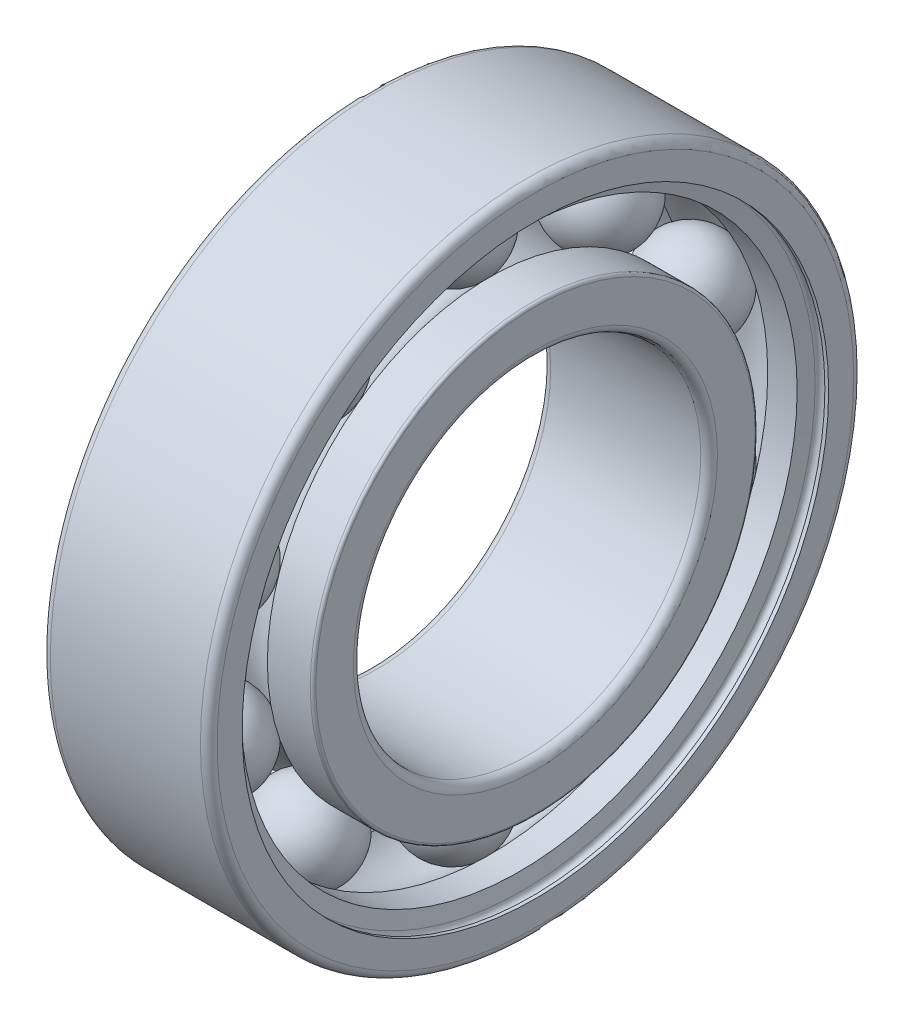
ISO-10303-21;
HEADER;
FILE_DESCRIPTION(('STEP AP214'),'2;1');
FILE_NAME('part.step','',(''),(''),'','','');
FILE_SCHEMA(('AUTOMOTIVE_DESIGN { 1 0 10303 214 1 1 1 1 }'));
ENDSEC;
DATA;
#1=APPLICATION_CONTEXT('core data for automotive mechanical design processes');
#2=APPLICATION_PROTOCOL_DEFINITION('international standard','automotive_design',2000,#1);
#3=PRODUCT_CONTEXT('',#1,'mechanical');
#4=PRODUCT('Part','Part','',(#3));
#5=PRODUCT_RELATED_PRODUCT_CATEGORY('part','',(#4));
#6=PRODUCT_DEFINITION_FORMATION('','',#4);
#7=PRODUCT_DEFINITION_CONTEXT('part definition',#1,'design');
#8=PRODUCT_DEFINITION('design','',#6,#7);
#9=PRODUCT_DEFINITION_SHAPE('','',#8);
#10=(LENGTH_UNIT() NAMED_UNIT(*) SI_UNIT(.MILLI.,.METRE.));
#11=(NAMED_UNIT(*) PLANE_ANGLE_UNIT() SI_UNIT($,.RADIAN.));
#12=(NAMED_UNIT(*) SI_UNIT($,.STERADIAN.) SOLID_ANGLE_UNIT());
#13=UNCERTAINTY_MEASURE_WITH_UNIT(LENGTH_MEASURE(1.E-05),#10,'distance_accuracy_value','');
#14=(GEOMETRIC_REPRESENTATION_CONTEXT(3) GLOBAL_UNCERTAINTY_ASSIGNED_CONTEXT((#13)) GLOBAL_UNIT_ASSIGNED_CONTEXT((#10,
#11,#12)) REPRESENTATION_CONTEXT('',''));
#15=CARTESIAN_POINT('',(0.,0.,0.));
#16=DIRECTION('',(0.,0.,1.));
#17=DIRECTION('',(1.,0.,0.));
#18=AXIS2_PLACEMENT_3D('',#15,#16,#17);
#19=CARTESIAN_POINT('',(0.599999999999874,0.,0.));
#20=DIRECTION('',(1.,0.,0.));
#21=DIRECTION('',(0.,0.,-1.));
#22=AXIS2_PLACEMENT_3D('',#19,#20,#21);
#23=TOROIDAL_SURFACE('',#22,13.0999999999999,0.599999999999874);
#24=CARTESIAN_POINT('',(0.6,0.,0.));
#25=DIRECTION('',(1.,0.,0.));
#26=DIRECTION('',(0.,0.,-1.));
#27=AXIS2_PLACEMENT_3D('',#24,#25,#26);
#28=CIRCLE('',#27,12.5);
#29=CARTESIAN_POINT('',(0.6,0.,-12.5));
#30=VERTEX_POINT('',#29);
#31=EDGE_CURVE('P0_E10',#30,#30,#28,.T.);
#32=ORIENTED_EDGE('',*,*,#31,.T.);
#33=EDGE_LOOP('',(#32));
#34=FACE_BOUND('',#33,.T.);
#35=CARTESIAN_POINT('',(0.,0.,0.));
#36=DIRECTION('',(1.,0.,0.));
#37=DIRECTION('',(0.,0.,-1.));
#38=AXIS2_PLACEMENT_3D('',#35,#36,#37);
#39=CIRCLE('',#38,13.1);
#40=CARTESIAN_POINT('',(0.,0.,-13.1));
#41=VERTEX_POINT('',#40);
#42=EDGE_CURVE('P0_E48',#41,#41,#39,.T.);
#43=ORIENTED_EDGE('',*,*,#42,.F.);
#44=EDGE_LOOP('',(#43));
#45=FACE_BOUND('',#44,.T.);
#46=ADVANCED_FACE('P0_F14',(#34,#45),#23,.T.);
#47=CARTESIAN_POINT('',(11.4,0.,0.));
#48=DIRECTION('',(1.,0.,0.));
#49=DIRECTION('',(0.,0.,-1.));
#50=AXIS2_PLACEMENT_3D('',#47,#48,#49);
#51=CYLINDRICAL_SURFACE('',#50,12.5);
#52=CARTESIAN_POINT('',(11.4,0.,0.));
#53=DIRECTION('',(1.,0.,0.));
#54=DIRECTION('',(0.,0.,-1.));
#55=AXIS2_PLACEMENT_3D('',#52,#53,#54);
#56=CIRCLE('',#55,12.5);
#57=CARTESIAN_POINT('',(11.4,0.,-12.5));
#58=VERTEX_POINT('',#57);
#59=EDGE_CURVE('P0_E20',#58,#58,#56,.T.);
#60=ORIENTED_EDGE('',*,*,#59,.T.);
#61=EDGE_LOOP('',(#60));
#62=FACE_BOUND('',#61,.T.);
#63=ORIENTED_EDGE('',*,*,#31,.F.);
#64=EDGE_LOOP('',(#63));
#65=FACE_BOUND('',#64,.T.);
#66=ADVANCED_FACE('P0_F56',(#62,#65),#51,.F.);
#67=CARTESIAN_POINT('',(11.4000000000002,0.,0.));
#68=DIRECTION('',(1.,0.,0.));
#69=DIRECTION('',(0.,0.,-1.));
#70=AXIS2_PLACEMENT_3D('',#67,#68,#69);
#71=TOROIDAL_SURFACE('',#70,13.0999999999998,0.599999999999754);
#72=CARTESIAN_POINT('',(12.,0.,0.));
#73=DIRECTION('',(1.,0.,0.));
#74=DIRECTION('',(0.,0.,-1.));
#75=AXIS2_PLACEMENT_3D('',#72,#73,#74);
#76=CIRCLE('',#75,13.1);
#77=CARTESIAN_POINT('',(12.,0.,-13.1));
#78=VERTEX_POINT('',#77);
#79=EDGE_CURVE('P0_E24',#78,#78,#76,.T.);
#80=ORIENTED_EDGE('',*,*,#79,.T.);
#81=EDGE_LOOP('',(#80));
#82=FACE_BOUND('',#81,.T.);
#83=ORIENTED_EDGE('',*,*,#59,.F.);
#84=EDGE_LOOP('',(#83));
#85=FACE_BOUND('',#84,.T.);
#86=ADVANCED_FACE('P0_F61',(#82,#85),#71,.T.);
#87=CARTESIAN_POINT('',(12.,13.1,0.));
#88=DIRECTION('',(1.,0.,0.));
#89=DIRECTION('',(0.,0.,-1.));
#90=AXIS2_PLACEMENT_3D('',#87,#88,#89);
#91=PLANE('',#90);
#92=CARTESIAN_POINT('',(12.,0.,0.));
#93=DIRECTION('',(1.,0.,0.));
#94=DIRECTION('',(0.,0.,-1.));
#95=AXIS2_PLACEMENT_3D('',#92,#93,#94);
#96=CIRCLE('',#95,15.8);
#97=CARTESIAN_POINT('',(12.,0.,-15.8));
#98=VERTEX_POINT('',#97);
#99=EDGE_CURVE('P0_E28',#98,#98,#96,.T.);
#100=ORIENTED_EDGE('',*,*,#99,.T.);
#101=EDGE_LOOP('',(#100));
#102=FACE_BOUND('',#101,.T.);
#103=ORIENTED_EDGE('',*,*,#79,.F.);
#104=EDGE_LOOP('',(#103));
#105=FACE_BOUND('',#104,.T.);
#106=ADVANCED_FACE('P0_F65',(#102,#105),#91,.T.);
#107=CARTESIAN_POINT('',(11.7999999999989,0.,0.));
#108=DIRECTION('',(1.,0.,0.));
#109=DIRECTION('',(0.,0.,-1.));
#110=AXIS2_PLACEMENT_3D('',#107,#108,#109);
#111=TOROIDAL_SURFACE('',#110,15.7999999999989,0.200000000001057);
#112=CARTESIAN_POINT('',(11.8,0.,0.));
#113=DIRECTION('',(1.,0.,0.));
#114=DIRECTION('',(0.,0.,-1.));
#115=AXIS2_PLACEMENT_3D('',#112,#113,#114);
#116=CIRCLE('',#115,16.);
#117=CARTESIAN_POINT('',(11.8,0.,-16.));
#118=VERTEX_POINT('',#117);
#119=EDGE_CURVE('P0_E33',#118,#118,#116,.T.);
#120=ORIENTED_EDGE('',*,*,#119,.T.);
#121=EDGE_LOOP('',(#120));
#122=FACE_BOUND('',#121,.T.);
#123=ORIENTED_EDGE('',*,*,#99,.F.);
#124=EDGE_LOOP('',(#123));
#125=FACE_BOUND('',#124,.T.);
#126=ADVANCED_FACE('P0_F72',(#122,#125),#111,.T.);
#127=CARTESIAN_POINT('',(11.4,0.,0.));
#128=DIRECTION('',(1.,0.,0.));
#129=DIRECTION('',(0.,0.,-1.));
#130=AXIS2_PLACEMENT_3D('',#127,#128,#129);
#131=CYLINDRICAL_SURFACE('',#130,16.);
#132=CARTESIAN_POINT('',(8.7173288354559,0.,0.));
#133=DIRECTION('',(1.,0.,0.));
#134=DIRECTION('',(0.,0.,-1.));
#135=AXIS2_PLACEMENT_3D('',#132,#133,#134);
#136=CIRCLE('',#135,16.);
#137=CARTESIAN_POINT('',(8.7173288354559,0.,-16.));
#138=VERTEX_POINT('',#137);
#139=EDGE_CURVE('P0_E36',#138,#138,#136,.T.);
#140=ORIENTED_EDGE('',*,*,#139,.T.);
#141=EDGE_LOOP('',(#140));
#142=FACE_BOUND('',#141,.T.);
#143=ORIENTED_EDGE('',*,*,#119,.F.);
#144=EDGE_LOOP('',(#143));
#145=FACE_BOUND('',#144,.T.);
#146=ADVANCED_FACE('P0_F76',(#142,#145),#131,.T.);
#147=CARTESIAN_POINT('',(6.,0.,0.));
#148=DIRECTION('',(1.,0.,0.));
#149=DIRECTION('',(0.,0.,-1.));
#150=AXIS2_PLACEMENT_3D('',#147,#148,#149);
#151=TOROIDAL_SURFACE('',#150,18.,3.37400000000004);
#152=CARTESIAN_POINT('',(3.2826711645441,0.,0.));
#153=DIRECTION('',(1.,0.,0.));
#154=DIRECTION('',(0.,0.,-1.));
#155=AXIS2_PLACEMENT_3D('',#152,#153,#154);
#156=CIRCLE('',#155,16.);
#157=CARTESIAN_POINT('',(3.2826711645441,0.,-16.));
#158=VERTEX_POINT('',#157);
#159=EDGE_CURVE('P0_E39',#158,#158,#156,.T.);
#160=ORIENTED_EDGE('',*,*,#159,.T.);
#161=EDGE_LOOP('',(#160));
#162=FACE_BOUND('',#161,.T.);
#163=ORIENTED_EDGE('',*,*,#139,.F.);
#164=EDGE_LOOP('',(#163));
#165=FACE_BOUND('',#164,.T.);
#166=ADVANCED_FACE('P0_F80',(#162,#165),#151,.F.);
#167=CARTESIAN_POINT('',(11.4,0.,0.));
#168=DIRECTION('',(1.,0.,0.));
#169=DIRECTION('',(0.,0.,-1.));
#170=AXIS2_PLACEMENT_3D('',#167,#168,#169);
#171=CYLINDRICAL_SURFACE('',#170,16.);
#172=CARTESIAN_POINT('',(0.200000000000001,0.,0.));
#173=DIRECTION('',(1.,0.,0.));
#174=DIRECTION('',(0.,0.,-1.));
#175=AXIS2_PLACEMENT_3D('',#172,#173,#174);
#176=CIRCLE('',#175,16.);
#177=CARTESIAN_POINT('',(0.200000000000001,0.,-16.));
#178=VERTEX_POINT('',#177);
#179=EDGE_CURVE('P0_E42',#178,#178,#176,.T.);
#180=ORIENTED_EDGE('',*,*,#179,.T.);
#181=EDGE_LOOP('',(#180));
#182=FACE_BOUND('',#181,.T.);
#183=ORIENTED_EDGE('',*,*,#159,.F.);
#184=EDGE_LOOP('',(#183));
#185=FACE_BOUND('',#184,.T.);
#186=ADVANCED_FACE('P0_F84',(#182,#185),#171,.T.);
#187=CARTESIAN_POINT('',(0.20000000000053,0.,0.));
#188=DIRECTION('',(1.,0.,0.));
#189=DIRECTION('',(0.,0.,-1.));
#190=AXIS2_PLACEMENT_3D('',#187,#188,#189);
#191=TOROIDAL_SURFACE('',#190,15.7999999999995,0.20000000000053);
#192=CARTESIAN_POINT('',(0.,0.,0.));
#193=DIRECTION('',(1.,0.,0.));
#194=DIRECTION('',(0.,0.,-1.));
#195=AXIS2_PLACEMENT_3D('',#192,#193,#194);
#196=CIRCLE('',#195,15.8);
#197=CARTESIAN_POINT('',(0.,0.,-15.8));
#198=VERTEX_POINT('',#197);
#199=EDGE_CURVE('P0_E45',#198,#198,#196,.T.);
#200=ORIENTED_EDGE('',*,*,#199,.T.);
#201=EDGE_LOOP('',(#200));
#202=FACE_BOUND('',#201,.T.);
#203=ORIENTED_EDGE('',*,*,#179,.F.);
#204=EDGE_LOOP('',(#203));
#205=FACE_BOUND('',#204,.T.);
#206=ADVANCED_FACE('P0_F88',(#202,#205),#191,.T.);
#207=CARTESIAN_POINT('',(0.,15.8,0.));
#208=DIRECTION('',(-1.,0.,0.));
#209=DIRECTION('',(0.,0.,1.));
#210=AXIS2_PLACEMENT_3D('',#207,#208,#209);
#211=PLANE('',#210);
#212=ORIENTED_EDGE('',*,*,#42,.T.);
#213=EDGE_LOOP('',(#212));
#214=FACE_BOUND('',#213,.T.);
#215=ORIENTED_EDGE('',*,*,#199,.F.);
#216=EDGE_LOOP('',(#215));
#217=FACE_BOUND('',#216,.T.);
#218=ADVANCED_FACE('P0_F52',(#214,#217),#211,.T.);
#219=CLOSED_SHELL('',(#46,#66,#86,#106,#126,#146,#166,#186,#206,#218));
#220=MANIFOLD_SOLID_BREP('P0_B1',#219);
#221=CARTESIAN_POINT('',(0.599999999999879,0.,0.));
#222=DIRECTION('',(1.,0.,0.));
#223=DIRECTION('',(0.,0.,-1.));
#224=AXIS2_PLACEMENT_3D('',#221,#222,#223);
#225=TOROIDAL_SURFACE('',#224,22.9000000000001,0.59999999999988);
#226=CARTESIAN_POINT('',(0.,0.,0.));
#227=DIRECTION('',(1.,0.,0.));
#228=DIRECTION('',(0.,0.,-1.));
#229=AXIS2_PLACEMENT_3D('',#226,#227,#228);
#230=CIRCLE('',#229,22.9);
#231=CARTESIAN_POINT('',(0.,0.,-22.9));
#232=VERTEX_POINT('',#231);
#233=EDGE_CURVE('P1_E10',#232,#232,#230,.T.);
#234=ORIENTED_EDGE('',*,*,#233,.T.);
#235=EDGE_LOOP('',(#234));
#236=FACE_BOUND('',#235,.T.);
#237=CARTESIAN_POINT('',(0.6,0.,0.));
#238=DIRECTION('',(1.,0.,0.));
#239=DIRECTION('',(0.,0.,-1.));
#240=AXIS2_PLACEMENT_3D('',#237,#238,#239);
#241=CIRCLE('',#240,23.5);
#242=CARTESIAN_POINT('',(0.6,0.,-23.5));
#243=VERTEX_POINT('',#242);
#244=EDGE_CURVE('P1_E60',#243,#243,#241,.T.);
#245=ORIENTED_EDGE('',*,*,#244,.F.);
#246=EDGE_LOOP('',(#245));
#247=FACE_BOUND('',#246,.T.);
#248=ADVANCED_FACE('P1_F14',(#236,#247),#225,.T.);
#249=CARTESIAN_POINT('',(0.,22.9,0.));
#250=DIRECTION('',(-1.,0.,0.));
#251=DIRECTION('',(0.,0.,1.));
#252=AXIS2_PLACEMENT_3D('',#249,#250,#251);
#253=PLANE('',#252);
#254=CARTESIAN_POINT('',(0.,0.,0.));
#255=DIRECTION('',(1.,0.,0.));
#256=DIRECTION('',(0.,0.,-1.));
#257=AXIS2_PLACEMENT_3D('',#254,#255,#256);
#258=CIRCLE('',#257,21.1);
#259=CARTESIAN_POINT('',(0.,0.,-21.1));
#260=VERTEX_POINT('',#259);
#261=EDGE_CURVE('P1_E20',#260,#260,#258,.T.);
#262=ORIENTED_EDGE('',*,*,#261,.T.);
#263=EDGE_LOOP('',(#262));
#264=FACE_BOUND('',#263,.T.);
#265=ORIENTED_EDGE('',*,*,#233,.F.);
#266=EDGE_LOOP('',(#265));
#267=FACE_BOUND('',#266,.T.);
#268=ADVANCED_FACE('P1_F68',(#264,#267),#253,.T.);
#269=CARTESIAN_POINT('',(11.4,0.,0.));
#270=DIRECTION('',(1.,0.,0.));
#271=DIRECTION('',(0.,0.,-1.));
#272=AXIS2_PLACEMENT_3D('',#269,#270,#271);
#273=CYLINDRICAL_SURFACE('',#272,21.1);
#274=CARTESIAN_POINT('',(0.272222222222221,0.,0.));
#275=DIRECTION('',(1.,0.,0.));
#276=DIRECTION('',(0.,0.,-1.));
#277=AXIS2_PLACEMENT_3D('',#274,#275,#276);
#278=CIRCLE('',#277,21.1);
#279=CARTESIAN_POINT('',(0.272222222222221,0.,-21.1));
#280=VERTEX_POINT('',#279);
#281=EDGE_CURVE('P1_E24',#280,#280,#278,.T.);
#282=ORIENTED_EDGE('',*,*,#281,.T.);
#283=EDGE_LOOP('',(#282));
#284=FACE_BOUND('',#283,.T.);
#285=ORIENTED_EDGE('',*,*,#261,.F.);
#286=EDGE_LOOP('',(#285));
#287=FACE_BOUND('',#286,.T.);
#288=ADVANCED_FACE('P1_F73',(#284,#287),#273,.F.);
#289=CARTESIAN_POINT('',(0.62222222222222,0.,0.));
#290=DIRECTION('',(1.,0.,0.));
#291=DIRECTION('',(0.,0.,-1.));
#292=AXIS2_PLACEMENT_3D('',#289,#290,#291);
#293=TOROIDAL_SURFACE('',#292,21.1,0.35);
#294=CARTESIAN_POINT('',(0.97222222222222,0.,0.));
#295=DIRECTION('',(1.,0.,0.));
#296=DIRECTION('',(0.,0.,-1.));
#297=AXIS2_PLACEMENT_3D('',#294,#295,#296);
#298=CIRCLE('',#297,21.1);
#299=CARTESIAN_POINT('',(0.97222222222222,0.,-21.1));
#300=VERTEX_POINT('',#299);
#301=EDGE_CURVE('P1_E28',#300,#300,#298,.T.);
#302=ORIENTED_EDGE('',*,*,#301,.T.);
#303=EDGE_LOOP('',(#302));
#304=FACE_BOUND('',#303,.T.);
#305=ORIENTED_EDGE('',*,*,#281,.F.);
#306=EDGE_LOOP('',(#305));
#307=FACE_BOUND('',#306,.T.);
#308=ADVANCED_FACE('P1_F77',(#304,#307),#293,.F.);
#309=CARTESIAN_POINT('',(0.97222222222222,0.,0.));
#310=DIRECTION('',(-1.,0.,0.));
#311=DIRECTION('',(0.,0.,1.));
#312=AXIS2_PLACEMENT_3D('',#309,#310,#311);
#313=CONICAL_SURFACE('',#312,21.1,1.39626340159549);
#314=CARTESIAN_POINT('',(1.1661819010015,0.,0.));
#315=DIRECTION('',(1.,0.,0.));
#316=DIRECTION('',(0.,0.,-1.));
#317=AXIS2_PLACEMENT_3D('',#314,#315,#316);
#318=CIRCLE('',#317,20.);
#319=CARTESIAN_POINT('',(1.1661819010015,0.,-20.));
#320=VERTEX_POINT('',#319);
#321=EDGE_CURVE('P1_E33',#320,#320,#318,.T.);
#322=ORIENTED_EDGE('',*,*,#321,.T.);
#323=EDGE_LOOP('',(#322));
#324=FACE_BOUND('',#323,.T.);
#325=ORIENTED_EDGE('',*,*,#301,.F.);
#326=EDGE_LOOP('',(#325));
#327=FACE_BOUND('',#326,.T.);
#328=ADVANCED_FACE('P1_F84',(#324,#327),#313,.F.);
#329=CARTESIAN_POINT('',(11.4,0.,0.));
#330=DIRECTION('',(1.,0.,0.));
#331=DIRECTION('',(0.,0.,-1.));
#332=AXIS2_PLACEMENT_3D('',#329,#330,#331);
#333=CYLINDRICAL_SURFACE('',#332,20.);
#334=CARTESIAN_POINT('',(3.2826711645441,0.,0.));
#335=DIRECTION('',(1.,0.,0.));
#336=DIRECTION('',(0.,0.,-1.));
#337=AXIS2_PLACEMENT_3D('',#334,#335,#336);
#338=CIRCLE('',#337,20.);
#339=CARTESIAN_POINT('',(3.2826711645441,0.,-20.));
#340=VERTEX_POINT('',#339);
#341=EDGE_CURVE('P1_E36',#340,#340,#338,.T.);
#342=ORIENTED_EDGE('',*,*,#341,.T.);
#343=EDGE_LOOP('',(#342));
#344=FACE_BOUND('',#343,.T.);
#345=ORIENTED_EDGE('',*,*,#321,.F.);
#346=EDGE_LOOP('',(#345));
#347=FACE_BOUND('',#346,.T.);
#348=ADVANCED_FACE('P1_F88',(#344,#347),#333,.F.);
#349=CARTESIAN_POINT('',(6.,0.,0.));
#350=DIRECTION('',(1.,0.,0.));
#351=DIRECTION('',(0.,0.,-1.));
#352=AXIS2_PLACEMENT_3D('',#349,#350,#351);
#353=TOROIDAL_SURFACE('',#352,18.,3.37400000000004);
#354=CARTESIAN_POINT('',(8.7173288354559,0.,0.));
#355=DIRECTION('',(1.,0.,0.));
#356=DIRECTION('',(0.,0.,-1.));
#357=AXIS2_PLACEMENT_3D('',#354,#355,#356);
#358=CIRCLE('',#357,20.);
#359=CARTESIAN_POINT('',(8.7173288354559,0.,-20.));
#360=VERTEX_POINT('',#359);
#361=EDGE_CURVE('P1_E39',#360,#360,#358,.T.);
#362=ORIENTED_EDGE('',*,*,#361,.T.);
#363=EDGE_LOOP('',(#362));
#364=FACE_BOUND('',#363,.T.);
#365=ORIENTED_EDGE('',*,*,#341,.F.);
#366=EDGE_LOOP('',(#365));
#367=FACE_BOUND('',#366,.T.);
#368=ADVANCED_FACE('P1_F92',(#364,#367),#353,.F.);
#369=CARTESIAN_POINT('',(11.4,0.,0.));
#370=DIRECTION('',(1.,0.,0.));
#371=DIRECTION('',(0.,0.,-1.));
#372=AXIS2_PLACEMENT_3D('',#369,#370,#371);
#373=CYLINDRICAL_SURFACE('',#372,20.);
#374=CARTESIAN_POINT('',(10.833818098998,0.,0.));
#375=DIRECTION('',(1.,0.,0.));
#376=DIRECTION('',(0.,0.,-1.));
#377=AXIS2_PLACEMENT_3D('',#374,#375,#376);
#378=CIRCLE('',#377,20.);
#379=CARTESIAN_POINT('',(10.833818098998,0.,-20.));
#380=VERTEX_POINT('',#379);
#381=EDGE_CURVE('P1_E42',#380,#380,#378,.T.);
#382=ORIENTED_EDGE('',*,*,#381,.T.);
#383=EDGE_LOOP('',(#382));
#384=FACE_BOUND('',#383,.T.);
#385=ORIENTED_EDGE('',*,*,#361,.F.);
#386=EDGE_LOOP('',(#385));
#387=FACE_BOUND('',#386,.T.);
#388=ADVANCED_FACE('P1_F96',(#384,#387),#373,.F.);
#389=CARTESIAN_POINT('',(10.833818098998,0.,0.));
#390=DIRECTION('',(1.,0.,0.));
#391=DIRECTION('',(0.,0.,-1.));
#392=AXIS2_PLACEMENT_3D('',#389,#390,#391);
#393=CONICAL_SURFACE('',#392,20.,1.39626340159486);
#394=CARTESIAN_POINT('',(11.027777777778,0.,0.));
#395=DIRECTION('',(1.,0.,0.));
#396=DIRECTION('',(0.,0.,-1.));
#397=AXIS2_PLACEMENT_3D('',#394,#395,#396);
#398=CIRCLE('',#397,21.1);
#399=CARTESIAN_POINT('',(11.027777777778,0.,-21.1));
#400=VERTEX_POINT('',#399);
#401=EDGE_CURVE('P1_E45',#400,#400,#398,.T.);
#402=ORIENTED_EDGE('',*,*,#401,.T.);
#403=EDGE_LOOP('',(#402));
#404=FACE_BOUND('',#403,.T.);
#405=ORIENTED_EDGE('',*,*,#381,.F.);
#406=EDGE_LOOP('',(#405));
#407=FACE_BOUND('',#406,.T.);
#408=ADVANCED_FACE('P1_F100',(#404,#407),#393,.F.);
#409=CARTESIAN_POINT('',(11.377777777778,0.,0.));
#410=DIRECTION('',(1.,0.,0.));
#411=DIRECTION('',(0.,0.,-1.));
#412=AXIS2_PLACEMENT_3D('',#409,#410,#411);
#413=TOROIDAL_SURFACE('',#412,21.10000001666,0.35);
#414=CARTESIAN_POINT('',(11.727777777778,0.,0.));
#415=DIRECTION('',(1.,0.,0.));
#416=DIRECTION('',(0.,0.,-1.));
#417=AXIS2_PLACEMENT_3D('',#414,#415,#416);
#418=CIRCLE('',#417,21.1);
#419=CARTESIAN_POINT('',(11.727777777778,0.,-21.1));
#420=VERTEX_POINT('',#419);
#421=EDGE_CURVE('P1_E48',#420,#420,#418,.T.);
#422=ORIENTED_EDGE('',*,*,#421,.T.);
#423=EDGE_LOOP('',(#422));
#424=FACE_BOUND('',#423,.T.);
#425=ORIENTED_EDGE('',*,*,#401,.F.);
#426=EDGE_LOOP('',(#425));
#427=FACE_BOUND('',#426,.T.);
#428=ADVANCED_FACE('P1_F104',(#424,#427),#413,.F.);
#429=CARTESIAN_POINT('',(11.4,0.,0.));
#430=DIRECTION('',(1.,0.,0.));
#431=DIRECTION('',(0.,0.,-1.));
#432=AXIS2_PLACEMENT_3D('',#429,#430,#431);
#433=CYLINDRICAL_SURFACE('',#432,21.1);
#434=CARTESIAN_POINT('',(12.,0.,0.));
#435=DIRECTION('',(1.,0.,0.));
#436=DIRECTION('',(0.,0.,-1.));
#437=AXIS2_PLACEMENT_3D('',#434,#435,#436);
#438=CIRCLE('',#437,21.1);
#439=CARTESIAN_POINT('',(12.,0.,-21.1));
#440=VERTEX_POINT('',#439);
#441=EDGE_CURVE('P1_E51',#440,#440,#438,.T.);
#442=ORIENTED_EDGE('',*,*,#441,.T.);
#443=EDGE_LOOP('',(#442));
#444=FACE_BOUND('',#443,.T.);
#445=ORIENTED_EDGE('',*,*,#421,.F.);
#446=EDGE_LOOP('',(#445));
#447=FACE_BOUND('',#446,.T.);
#448=ADVANCED_FACE('P1_F108',(#444,#447),#433,.F.);
#449=CARTESIAN_POINT('',(12.,21.1,0.));
#450=DIRECTION('',(1.,0.,0.));
#451=DIRECTION('',(0.,0.,-1.));
#452=AXIS2_PLACEMENT_3D('',#449,#450,#451);
#453=PLANE('',#452);
#454=CARTESIAN_POINT('',(12.,0.,0.));
#455=DIRECTION('',(1.,0.,0.));
#456=DIRECTION('',(0.,0.,-1.));
#457=AXIS2_PLACEMENT_3D('',#454,#455,#456);
#458=CIRCLE('',#457,22.9);
#459=CARTESIAN_POINT('',(12.,0.,-22.9));
#460=VERTEX_POINT('',#459);
#461=EDGE_CURVE('P1_E54',#460,#460,#458,.T.);
#462=ORIENTED_EDGE('',*,*,#461,.T.);
#463=EDGE_LOOP('',(#462));
#464=FACE_BOUND('',#463,.T.);
#465=ORIENTED_EDGE('',*,*,#441,.F.);
#466=EDGE_LOOP('',(#465));
#467=FACE_BOUND('',#466,.T.);
#468=ADVANCED_FACE('P1_F112',(#464,#467),#453,.T.);
#469=CARTESIAN_POINT('',(11.4000000000002,0.,0.));
#470=DIRECTION('',(1.,0.,0.));
#471=DIRECTION('',(0.,0.,-1.));
#472=AXIS2_PLACEMENT_3D('',#469,#470,#471);
#473=TOROIDAL_SURFACE('',#472,22.9000000000002,0.599999999999759);
#474=CARTESIAN_POINT('',(11.4,0.,0.));
#475=DIRECTION('',(1.,0.,0.));
#476=DIRECTION('',(0.,0.,-1.));
#477=AXIS2_PLACEMENT_3D('',#474,#475,#476);
#478=CIRCLE('',#477,23.5);
#479=CARTESIAN_POINT('',(11.4,0.,-23.5));
#480=VERTEX_POINT('',#479);
#481=EDGE_CURVE('P1_E57',#480,#480,#478,.T.);
#482=ORIENTED_EDGE('',*,*,#481,.T.);
#483=EDGE_LOOP('',(#482));
#484=FACE_BOUND('',#483,.T.);
#485=ORIENTED_EDGE('',*,*,#461,.F.);
#486=EDGE_LOOP('',(#485));
#487=FACE_BOUND('',#486,.T.);
#488=ADVANCED_FACE('P1_F116',(#484,#487),#473,.T.);
#489=CARTESIAN_POINT('',(11.4,0.,0.));
#490=DIRECTION('',(1.,0.,0.));
#491=DIRECTION('',(0.,0.,-1.));
#492=AXIS2_PLACEMENT_3D('',#489,#490,#491);
#493=CYLINDRICAL_SURFACE('',#492,23.5);
#494=ORIENTED_EDGE('',*,*,#244,.T.);
#495=EDGE_LOOP('',(#494));
#496=FACE_BOUND('',#495,.T.);
#497=ORIENTED_EDGE('',*,*,#481,.F.);
#498=EDGE_LOOP('',(#497));
#499=FACE_BOUND('',#498,.T.);
#500=ADVANCED_FACE('P1_F64',(#496,#499),#493,.T.);
#501=CLOSED_SHELL('',(#248,#268,#288,#308,#328,#348,#368,#388,#408,#428,#448,#468,#488,#500));
#502=MANIFOLD_SOLID_BREP('P1_B1',#501);
#503=CARTESIAN_POINT('',(6.,18.,0.));
#504=DIRECTION('',(1.,0.,0.));
#505=DIRECTION('',(0.,-1.,0.));
#506=AXIS2_PLACEMENT_3D('',#503,#504,#505);
#507=SPHERICAL_SURFACE('',#506,3.374);
#508=CARTESIAN_POINT('',(9.374,18.,0.));
#509=VERTEX_POINT('',#508);
#510=VERTEX_LOOP('',#509);
#511=FACE_BOUND('',#510,.T.);
#512=ADVANCED_FACE('P2_F12',(#511),#507,.T.);
#513=CLOSED_SHELL('',(#512));
#514=MANIFOLD_SOLID_BREP('P2_B1',#513);
#515=CARTESIAN_POINT('',(6.,14.5623058987491,10.5801345412645));
#516=DIRECTION('',(1.,0.,0.));
#517=DIRECTION('',(0.,-0.80901699437495,-0.58778525229247));
#518=AXIS2_PLACEMENT_3D('',#515,#516,#517);
#519=SPHERICAL_SURFACE('',#518,3.374);
#520=CARTESIAN_POINT('',(9.374,14.5623058987491,10.5801345412645));
#521=VERTEX_POINT('',#520);
#522=VERTEX_LOOP('',#521);
#523=FACE_BOUND('',#522,.T.);
#524=ADVANCED_FACE('P3_F12',(#523),#519,.T.);
#525=CLOSED_SHELL('',(#524));
#526=MANIFOLD_SOLID_BREP('P3_B1',#525);
#527=CARTESIAN_POINT('',(6.,14.5623058987491,-10.5801345412645));
#528=DIRECTION('',(1.,0.,0.));
#529=DIRECTION('',(0.,-0.80901699437495,0.58778525229247));
#530=AXIS2_PLACEMENT_3D('',#527,#528,#529);
#531=SPHERICAL_SURFACE('',#530,3.374);
#532=CARTESIAN_POINT('',(9.374,14.5623058987491,-10.5801345412645));
#533=VERTEX_POINT('',#532);
#534=VERTEX_LOOP('',#533);
#535=FACE_BOUND('',#534,.T.);
#536=ADVANCED_FACE('P4_F12',(#535),#531,.T.);
#537=CLOSED_SHELL('',(#536));
#538=MANIFOLD_SOLID_BREP('P4_B1',#537);
#539=CARTESIAN_POINT('',(6.,5.56230589874911,-17.1190172933127));
#540=DIRECTION('',(1.,0.,0.));
#541=DIRECTION('',(0.,-0.309016994374951,0.951056516295153));
#542=AXIS2_PLACEMENT_3D('',#539,#540,#541);
#543=SPHERICAL_SURFACE('',#542,3.374);
#544=CARTESIAN_POINT('',(9.374,5.56230589874911,-17.1190172933127));
#545=VERTEX_POINT('',#544);
#546=VERTEX_LOOP('',#545);
#547=FACE_BOUND('',#546,.T.);
#548=ADVANCED_FACE('P5_F12',(#547),#543,.T.);
#549=CLOSED_SHELL('',(#548));
#550=MANIFOLD_SOLID_BREP('P5_B1',#549);
#551=CARTESIAN_POINT('',(6.,-5.56230589874911,-17.1190172933127));
#552=DIRECTION('',(1.,0.,0.));
#553=DIRECTION('',(0.,0.309016994374951,0.951056516295153));
#554=AXIS2_PLACEMENT_3D('',#551,#552,#553);
#555=SPHERICAL_SURFACE('',#554,3.374);
#556=CARTESIAN_POINT('',(9.374,-5.56230589874911,-17.1190172933127));
#557=VERTEX_POINT('',#556);
#558=VERTEX_LOOP('',#557);
#559=FACE_BOUND('',#558,.T.);
#560=ADVANCED_FACE('P6_F12',(#559),#555,.T.);
#561=CLOSED_SHELL('',(#560));
#562=MANIFOLD_SOLID_BREP('P6_B1',#561);
#563=CARTESIAN_POINT('',(6.,-14.5623058987491,-10.5801345412645));
#564=DIRECTION('',(1.,0.,0.));
#565=DIRECTION('',(0.,0.80901699437495,0.58778525229247));
#566=AXIS2_PLACEMENT_3D('',#563,#564,#565);
#567=SPHERICAL_SURFACE('',#566,3.374);
#568=CARTESIAN_POINT('',(9.374,-14.5623058987491,-10.5801345412645));
#569=VERTEX_POINT('',#568);
#570=VERTEX_LOOP('',#569);
#571=FACE_BOUND('',#570,.T.);
#572=ADVANCED_FACE('P7_F12',(#571),#567,.T.);
#573=CLOSED_SHELL('',(#572));
#574=MANIFOLD_SOLID_BREP('P7_B1',#573);
#575=CARTESIAN_POINT('',(6.,-18.,0.));
#576=DIRECTION('',(1.,0.,0.));
#577=DIRECTION('',(0.,1.,0.));
#578=AXIS2_PLACEMENT_3D('',#575,#576,#577);
#579=SPHERICAL_SURFACE('',#578,3.374);
#580=CARTESIAN_POINT('',(9.374,-18.,0.));
#581=VERTEX_POINT('',#580);
#582=VERTEX_LOOP('',#581);
#583=FACE_BOUND('',#582,.T.);
#584=ADVANCED_FACE('P8_F12',(#583),#579,.T.);
#585=CLOSED_SHELL('',(#584));
#586=MANIFOLD_SOLID_BREP('P8_B1',#585);
#587=CARTESIAN_POINT('',(6.,-14.5623058987491,10.5801345412645));
#588=DIRECTION('',(1.,0.,0.));
#589=DIRECTION('',(0.,0.80901699437495,-0.58778525229247));
#590=AXIS2_PLACEMENT_3D('',#587,#588,#589);
#591=SPHERICAL_SURFACE('',#590,3.374);
#592=CARTESIAN_POINT('',(9.374,-14.5623058987491,10.5801345412645));
#593=VERTEX_POINT('',#592);
#594=VERTEX_LOOP('',#593);
#595=FACE_BOUND('',#594,.T.);
#596=ADVANCED_FACE('P9_F12',(#595),#591,.T.);
#597=CLOSED_SHELL('',(#596));
#598=MANIFOLD_SOLID_BREP('P9_B1',#597);
#599=CARTESIAN_POINT('',(6.,-5.56230589874911,17.1190172933127));
#600=DIRECTION('',(1.,0.,0.));
#601=DIRECTION('',(0.,0.309016994374951,-0.951056516295153));
#602=AXIS2_PLACEMENT_3D('',#599,#600,#601);
#603=SPHERICAL_SURFACE('',#602,3.374);
#604=CARTESIAN_POINT('',(9.374,-5.56230589874911,17.1190172933127));
#605=VERTEX_POINT('',#604);
#606=VERTEX_LOOP('',#605);
#607=FACE_BOUND('',#606,.T.);
#608=ADVANCED_FACE('P10_F12',(#607),#603,.T.);
#609=CLOSED_SHELL('',(#608));
#610=MANIFOLD_SOLID_BREP('P10_B1',#609);
#611=CARTESIAN_POINT('',(6.,5.56230589874911,17.1190172933127));
#612=DIRECTION('',(1.,0.,0.));
#613=DIRECTION('',(0.,-0.309016994374951,-0.951056516295153));
#614=AXIS2_PLACEMENT_3D('',#611,#612,#613);
#615=SPHERICAL_SURFACE('',#614,3.374);
#616=CARTESIAN_POINT('',(9.374,5.56230589874911,17.1190172933127));
#617=VERTEX_POINT('',#616);
#618=VERTEX_LOOP('',#617);
#619=FACE_BOUND('',#618,.T.);
#620=ADVANCED_FACE('P11_F12',(#619),#615,.T.);
#621=CLOSED_SHELL('',(#620));
#622=MANIFOLD_SOLID_BREP('P11_B1',#621);
#623=ADVANCED_BREP_SHAPE_REPRESENTATION('',(#18,#220,#502,#514,#526,#538,#550,#562,#574,#586,
#598,#610,#622),#14);
#624=SHAPE_DEFINITION_REPRESENTATION(#9,#623);
ENDSEC;
END-ISO-10303-21;
